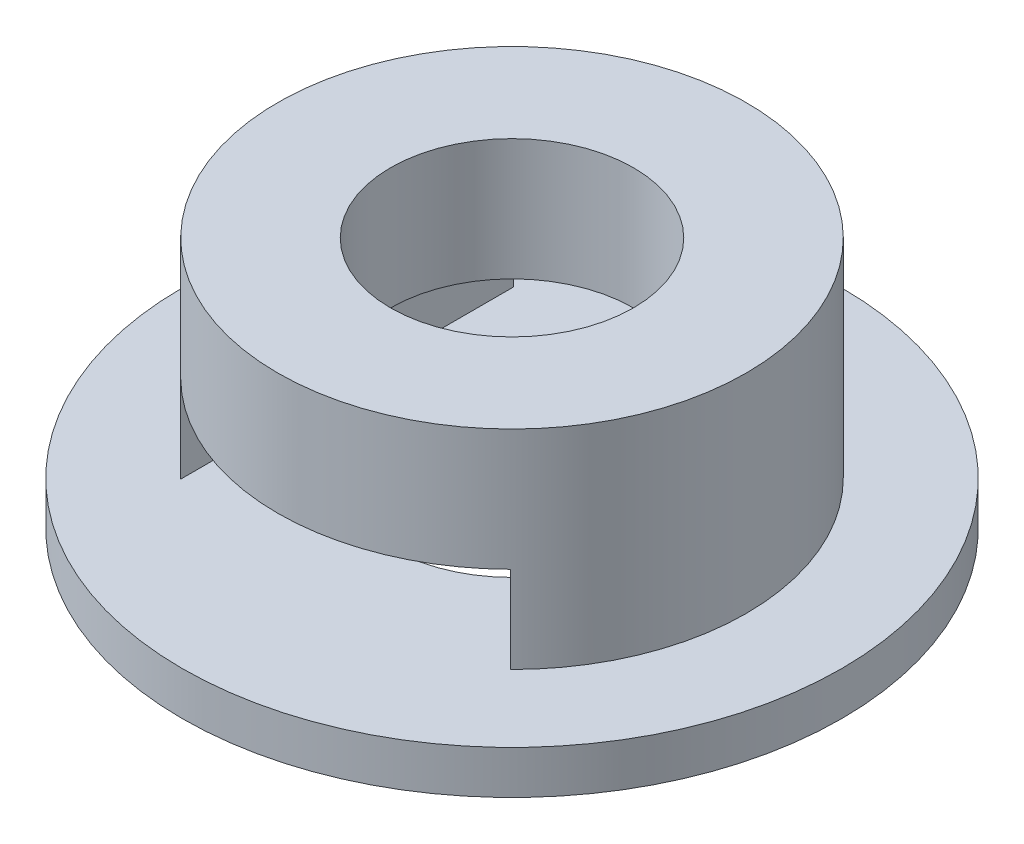
ISO-10303-21;
HEADER;
FILE_DESCRIPTION(('STEP AP214'),'2;1');
FILE_NAME('part.step','',(''),(''),'','','');
FILE_SCHEMA(('AUTOMOTIVE_DESIGN { 1 0 10303 214 1 1 1 1 }'));
ENDSEC;
DATA;
#1=APPLICATION_CONTEXT('core data for automotive mechanical design processes');
#2=APPLICATION_PROTOCOL_DEFINITION('international standard','automotive_design',2000,#1);
#3=PRODUCT_CONTEXT('',#1,'mechanical');
#4=PRODUCT('Part','Part','',(#3));
#5=PRODUCT_RELATED_PRODUCT_CATEGORY('part','',(#4));
#6=PRODUCT_DEFINITION_FORMATION('','',#4);
#7=PRODUCT_DEFINITION_CONTEXT('part definition',#1,'design');
#8=PRODUCT_DEFINITION('design','',#6,#7);
#9=PRODUCT_DEFINITION_SHAPE('','',#8);
#10=(LENGTH_UNIT() NAMED_UNIT(*) SI_UNIT(.MILLI.,.METRE.));
#11=(NAMED_UNIT(*) PLANE_ANGLE_UNIT() SI_UNIT($,.RADIAN.));
#12=(NAMED_UNIT(*) SI_UNIT($,.STERADIAN.) SOLID_ANGLE_UNIT());
#13=UNCERTAINTY_MEASURE_WITH_UNIT(LENGTH_MEASURE(1.E-05),#10,'distance_accuracy_value','');
#14=(GEOMETRIC_REPRESENTATION_CONTEXT(3) GLOBAL_UNCERTAINTY_ASSIGNED_CONTEXT((#13)) GLOBAL_UNIT_ASSIGNED_CONTEXT((#10,
#11,#12)) REPRESENTATION_CONTEXT('',''));
#15=CARTESIAN_POINT('',(0.,0.,0.));
#16=DIRECTION('',(0.,0.,1.));
#17=DIRECTION('',(1.,0.,0.));
#18=AXIS2_PLACEMENT_3D('',#15,#16,#17);
#19=CARTESIAN_POINT('',(0.,0.,0.));
#20=DIRECTION('',(0.,1.,0.));
#21=DIRECTION('',(0.,0.,1.));
#22=AXIS2_PLACEMENT_3D('',#19,#20,#21);
#23=CYLINDRICAL_SURFACE('',#22,7.);
#24=CARTESIAN_POINT('',(0.,7.5,0.));
#25=DIRECTION('',(0.,1.,0.));
#26=DIRECTION('',(0.,0.,1.));
#27=AXIS2_PLACEMENT_3D('',#24,#25,#26);
#28=CIRCLE('',#27,7.);
#29=CARTESIAN_POINT('',(0.,7.5,7.));
#30=VERTEX_POINT('',#29);
#31=EDGE_CURVE('E108',#30,#30,#28,.F.);
#32=CARTESIAN_POINT('',(0.,14.5,0.));
#33=DIRECTION('',(0.,1.,0.));
#34=DIRECTION('',(0.,0.,1.));
#35=AXIS2_PLACEMENT_3D('',#32,#33,#34);
#36=CIRCLE('',#35,7.);
#37=CARTESIAN_POINT('',(0.,14.5,7.));
#38=VERTEX_POINT('',#37);
#39=EDGE_CURVE('E94',#38,#38,#36,.T.);
#40=CARTESIAN_POINT('',(0.,7.5,7.));
#41=CARTESIAN_POINT('',(0.,7.57291666666667,7.));
#42=CARTESIAN_POINT('',(0.,7.64583333333333,7.));
#43=CARTESIAN_POINT('',(0.,7.79166666666667,7.));
#44=CARTESIAN_POINT('',(0.,7.86458333333333,7.));
#45=CARTESIAN_POINT('',(0.,8.01041666666667,7.));
#46=CARTESIAN_POINT('',(0.,8.08333333333333,7.));
#47=CARTESIAN_POINT('',(0.,8.22916666666667,7.));
#48=CARTESIAN_POINT('',(0.,8.30208333333333,7.));
#49=CARTESIAN_POINT('',(0.,8.44791666666667,7.));
#50=CARTESIAN_POINT('',(0.,8.52083333333333,7.));
#51=CARTESIAN_POINT('',(0.,8.66666666666667,7.));
#52=CARTESIAN_POINT('',(0.,8.73958333333333,7.));
#53=CARTESIAN_POINT('',(0.,8.88541666666667,7.));
#54=CARTESIAN_POINT('',(0.,8.95833333333333,7.));
#55=CARTESIAN_POINT('',(0.,9.10416666666667,7.));
#56=CARTESIAN_POINT('',(0.,9.17708333333333,7.));
#57=CARTESIAN_POINT('',(0.,9.32291666666667,7.));
#58=CARTESIAN_POINT('',(0.,9.39583333333333,7.));
#59=CARTESIAN_POINT('',(0.,9.54166666666667,7.));
#60=CARTESIAN_POINT('',(0.,9.61458333333333,7.));
#61=CARTESIAN_POINT('',(0.,9.76041666666667,7.));
#62=CARTESIAN_POINT('',(0.,9.83333333333333,7.));
#63=CARTESIAN_POINT('',(0.,9.97916666666667,7.));
#64=CARTESIAN_POINT('',(0.,10.0520833333333,7.));
#65=CARTESIAN_POINT('',(0.,10.1979166666667,7.));
#66=CARTESIAN_POINT('',(0.,10.2708333333333,7.));
#67=CARTESIAN_POINT('',(0.,10.4166666666667,7.));
#68=CARTESIAN_POINT('',(0.,10.4895833333333,7.));
#69=CARTESIAN_POINT('',(0.,10.6354166666667,7.));
#70=CARTESIAN_POINT('',(0.,10.7083333333333,7.));
#71=CARTESIAN_POINT('',(0.,10.8541666666667,7.));
#72=CARTESIAN_POINT('',(0.,10.9270833333333,7.));
#73=CARTESIAN_POINT('',(0.,11.0729166666667,7.));
#74=CARTESIAN_POINT('',(0.,11.1458333333333,7.));
#75=CARTESIAN_POINT('',(0.,11.2916666666667,7.));
#76=CARTESIAN_POINT('',(0.,11.3645833333333,7.));
#77=CARTESIAN_POINT('',(0.,11.5104166666667,7.));
#78=CARTESIAN_POINT('',(0.,11.5833333333333,7.));
#79=CARTESIAN_POINT('',(0.,11.7291666666667,7.));
#80=CARTESIAN_POINT('',(0.,11.8020833333333,7.));
#81=CARTESIAN_POINT('',(0.,11.9479166666667,7.));
#82=CARTESIAN_POINT('',(0.,12.0208333333333,7.));
#83=CARTESIAN_POINT('',(0.,12.1666666666667,7.));
#84=CARTESIAN_POINT('',(0.,12.2395833333333,7.));
#85=CARTESIAN_POINT('',(0.,12.3854166666667,7.));
#86=CARTESIAN_POINT('',(0.,12.4583333333333,7.));
#87=CARTESIAN_POINT('',(0.,12.6041666666667,7.));
#88=CARTESIAN_POINT('',(0.,12.6770833333333,7.));
#89=CARTESIAN_POINT('',(0.,12.8229166666667,7.));
#90=CARTESIAN_POINT('',(0.,12.8958333333333,7.));
#91=CARTESIAN_POINT('',(0.,13.0416666666667,7.));
#92=CARTESIAN_POINT('',(0.,13.1145833333333,7.));
#93=CARTESIAN_POINT('',(0.,13.2604166666667,7.));
#94=CARTESIAN_POINT('',(0.,13.3333333333333,7.));
#95=CARTESIAN_POINT('',(0.,13.4791666666667,7.));
#96=CARTESIAN_POINT('',(0.,13.5520833333333,7.));
#97=CARTESIAN_POINT('',(0.,13.6979166666667,7.));
#98=CARTESIAN_POINT('',(0.,13.7708333333333,7.));
#99=CARTESIAN_POINT('',(0.,13.9166666666667,7.));
#100=CARTESIAN_POINT('',(0.,13.9895833333333,7.));
#101=CARTESIAN_POINT('',(0.,14.1354166666667,7.));
#102=CARTESIAN_POINT('',(0.,14.2083333333333,7.));
#103=CARTESIAN_POINT('',(0.,14.3541666666667,7.));
#104=CARTESIAN_POINT('',(0.,14.4270833333333,7.));
#105=CARTESIAN_POINT('',(0.,14.5,7.));
#106=B_SPLINE_CURVE_WITH_KNOTS('',3,(#40,#41,#42,#43,#44,#45,#46,#47,#48,#49,#50,#51,#52,#53,
#54,#55,#56,#57,#58,#59,#60,#61,#62,#63,#64,#65,#66,#67,#68,#69,#70,#71,#72,#73,#74,#75,#76,#77,
#78,#79,#80,#81,#82,#83,#84,#85,#86,#87,#88,#89,#90,#91,#92,#93,#94,#95,#96,#97,#98,#99,#100,
#101,#102,#103,#104,#105),.UNSPECIFIED.,.F.,.F.,(4,2,2,2,2,2,2,2,2,2,2,2,2,2,2,2,2,2,2,2,2,2,2,
2,2,2,2,2,2,2,2,2,4),(0.,0.21875,0.4375,0.65625,0.875,1.09375,1.3125,1.53125,1.75,1.96875,
2.1875,2.40625,2.625,2.84375,3.0625,3.28125,3.5,3.71875,3.9375,4.15625,4.375,4.59375,4.8125,
5.03125,5.25,5.46875,5.6875,5.90625,6.125,6.34375,6.5625,6.78125,7.),.UNSPECIFIED.);
#107=EDGE_CURVE('BSEAM33',#30,#38,#106,.T.);
#108=ORIENTED_EDGE('',*,*,#31,.T.);
#109=ORIENTED_EDGE('',*,*,#39,.T.);
#110=ORIENTED_EDGE('',*,*,#107,.T.);
#111=ORIENTED_EDGE('',*,*,#107,.F.);
#112=EDGE_LOOP('',(#108,#110,#109,#111));
#113=FACE_BOUND('',#112,.T.);
#114=ADVANCED_FACE('F33',(#113),#23,.F.);
#115=CARTESIAN_POINT('',(0.,2.5,0.));
#116=DIRECTION('',(0.,1.,0.));
#117=DIRECTION('',(0.,0.,1.));
#118=AXIS2_PLACEMENT_3D('',#115,#116,#117);
#119=PLANE('',#118);
#120=CARTESIAN_POINT('',(0.,2.5,0.));
#121=DIRECTION('',(0.,1.,0.));
#122=DIRECTION('',(0.,0.,1.));
#123=AXIS2_PLACEMENT_3D('',#120,#121,#122);
#124=CIRCLE('',#123,13.5);
#125=CARTESIAN_POINT('',(-9.5,2.5,-9.59166304662544));
#126=VERTEX_POINT('',#125);
#127=CARTESIAN_POINT('',(-9.5,2.5,9.59166304662544));
#128=VERTEX_POINT('',#127);
#129=EDGE_CURVE('E82',#126,#128,#124,.T.);
#130=ORIENTED_EDGE('',*,*,#129,.F.);
#131=DIRECTION('',(0.,0.,1.));
#132=VECTOR('',#131,1.);
#133=CARTESIAN_POINT('',(-9.5,2.5,-17.5));
#134=LINE('',#133,#132);
#135=EDGE_CURVE('E47',#126,#128,#134,.T.);
#136=ORIENTED_EDGE('',*,*,#135,.T.);
#137=EDGE_LOOP('',(#130,#136));
#138=FACE_BOUND('',#137,.T.);
#139=CARTESIAN_POINT('',(9.5,2.5,9.59166304662544));
#140=VERTEX_POINT('',#139);
#141=CARTESIAN_POINT('',(9.5,2.5,-9.59166304662544));
#142=VERTEX_POINT('',#141);
#143=EDGE_CURVE('E88',#140,#142,#124,.T.);
#144=ORIENTED_EDGE('',*,*,#143,.F.);
#145=DIRECTION('',(0.,0.,1.));
#146=VECTOR('',#145,1.);
#147=CARTESIAN_POINT('',(9.5,2.5,-17.5));
#148=LINE('',#147,#146);
#149=EDGE_CURVE('E54',#142,#140,#148,.T.);
#150=ORIENTED_EDGE('',*,*,#149,.F.);
#151=EDGE_LOOP('',(#144,#150));
#152=FACE_BOUND('',#151,.T.);
#153=CARTESIAN_POINT('',(0.,2.5,0.));
#154=DIRECTION('',(0.,1.,0.));
#155=DIRECTION('',(0.,0.,1.));
#156=AXIS2_PLACEMENT_3D('',#153,#154,#155);
#157=CIRCLE('',#156,19.);
#158=CARTESIAN_POINT('',(0.,2.5,19.));
#159=VERTEX_POINT('',#158);
#160=EDGE_CURVE('E99',#159,#159,#157,.T.);
#161=ORIENTED_EDGE('',*,*,#160,.T.);
#162=EDGE_LOOP('',(#161));
#163=FACE_BOUND('',#162,.T.);
#164=CARTESIAN_POINT('',(0.,2.5,0.));
#165=DIRECTION('',(0.,-1.,0.));
#166=DIRECTION('',(0.,0.,-1.));
#167=AXIS2_PLACEMENT_3D('',#164,#165,#166);
#168=CIRCLE('',#167,7.);
#169=CARTESIAN_POINT('',(0.,2.5,7.));
#170=VERTEX_POINT('',#169);
#171=EDGE_CURVE('E105',#170,#170,#168,.F.);
#172=ORIENTED_EDGE('',*,*,#171,.F.);
#173=EDGE_LOOP('',(#172));
#174=FACE_BOUND('',#173,.T.);
#175=ADVANCED_FACE('F87',(#138,#152,#163,#174),#119,.T.);
#176=CARTESIAN_POINT('',(0.,2.5,0.));
#177=DIRECTION('',(0.,-1.,0.));
#178=DIRECTION('',(0.,0.,-1.));
#179=AXIS2_PLACEMENT_3D('',#176,#177,#178);
#180=CYLINDRICAL_SURFACE('',#179,19.);
#181=ORIENTED_EDGE('',*,*,#160,.F.);
#182=EDGE_LOOP('',(#181));
#183=FACE_BOUND('',#182,.T.);
#184=CARTESIAN_POINT('',(0.,0.,0.));
#185=DIRECTION('',(0.,1.,0.));
#186=DIRECTION('',(0.,0.,1.));
#187=AXIS2_PLACEMENT_3D('',#184,#185,#186);
#188=CIRCLE('',#187,19.);
#189=CARTESIAN_POINT('',(0.,0.,19.));
#190=VERTEX_POINT('',#189);
#191=EDGE_CURVE('E102',#190,#190,#188,.T.);
#192=ORIENTED_EDGE('',*,*,#191,.T.);
#193=EDGE_LOOP('',(#192));
#194=FACE_BOUND('',#193,.T.);
#195=ADVANCED_FACE('F35',(#183,#194),#180,.T.);
#196=CARTESIAN_POINT('',(0.,0.,0.));
#197=DIRECTION('',(0.,1.,0.));
#198=DIRECTION('',(0.,0.,1.));
#199=AXIS2_PLACEMENT_3D('',#196,#197,#198);
#200=PLANE('',#199);
#201=CARTESIAN_POINT('',(0.,0.,0.));
#202=DIRECTION('',(0.,1.,0.));
#203=DIRECTION('',(0.,0.,1.));
#204=AXIS2_PLACEMENT_3D('',#201,#202,#203);
#205=CIRCLE('',#204,7.);
#206=CARTESIAN_POINT('',(0.,0.,7.));
#207=VERTEX_POINT('',#206);
#208=EDGE_CURVE('E89',#207,#207,#205,.T.);
#209=ORIENTED_EDGE('',*,*,#208,.T.);
#210=EDGE_LOOP('',(#209));
#211=FACE_BOUND('',#210,.T.);
#212=ORIENTED_EDGE('',*,*,#191,.F.);
#213=EDGE_LOOP('',(#212));
#214=FACE_BOUND('',#213,.T.);
#215=ADVANCED_FACE('F132',(#211,#214),#200,.F.);
#216=CARTESIAN_POINT('',(0.,14.5,0.));
#217=DIRECTION('',(0.,-1.,0.));
#218=DIRECTION('',(0.,0.,-1.));
#219=AXIS2_PLACEMENT_3D('',#216,#217,#218);
#220=CYLINDRICAL_SURFACE('',#219,13.5);
#221=CARTESIAN_POINT('',(0.,14.5,0.));
#222=DIRECTION('',(0.,1.,0.));
#223=DIRECTION('',(0.,0.,1.));
#224=AXIS2_PLACEMENT_3D('',#221,#222,#223);
#225=CIRCLE('',#224,13.5);
#226=CARTESIAN_POINT('',(0.,14.5,13.5));
#227=VERTEX_POINT('',#226);
#228=EDGE_CURVE('E92',#227,#227,#225,.T.);
#229=ORIENTED_EDGE('',*,*,#228,.F.);
#230=EDGE_LOOP('',(#229));
#231=FACE_BOUND('',#230,.T.);
#232=ORIENTED_EDGE('',*,*,#129,.T.);
#233=DIRECTION('',(0.,-1.,0.));
#234=VECTOR('',#233,1.);
#235=CARTESIAN_POINT('',(-9.5,14.5,9.59166304662544));
#236=LINE('',#235,#234);
#237=CARTESIAN_POINT('',(-9.5,7.5,9.59166304662544));
#238=VERTEX_POINT('',#237);
#239=EDGE_CURVE('E11',#128,#238,#236,.F.);
#240=ORIENTED_EDGE('',*,*,#239,.T.);
#241=CARTESIAN_POINT('',(0.,7.5,0.));
#242=DIRECTION('',(0.,1.,0.));
#243=DIRECTION('',(0.,0.,1.));
#244=AXIS2_PLACEMENT_3D('',#241,#242,#243);
#245=CIRCLE('',#244,13.5);
#246=CARTESIAN_POINT('',(9.5,7.5,9.59166304662544));
#247=VERTEX_POINT('',#246);
#248=EDGE_CURVE('E112',#238,#247,#245,.T.);
#249=ORIENTED_EDGE('',*,*,#248,.T.);
#250=DIRECTION('',(0.,-1.,0.));
#251=VECTOR('',#250,1.);
#252=CARTESIAN_POINT('',(9.5,14.5,9.59166304662544));
#253=LINE('',#252,#251);
#254=EDGE_CURVE('E41',#247,#140,#253,.T.);
#255=ORIENTED_EDGE('',*,*,#254,.T.);
#256=ORIENTED_EDGE('',*,*,#143,.T.);
#257=DIRECTION('',(0.,-1.,0.));
#258=VECTOR('',#257,1.);
#259=CARTESIAN_POINT('',(9.5,14.5,-9.59166304662544));
#260=LINE('',#259,#258);
#261=CARTESIAN_POINT('',(9.5,7.5,-9.59166304662544));
#262=VERTEX_POINT('',#261);
#263=EDGE_CURVE('E85',#142,#262,#260,.F.);
#264=ORIENTED_EDGE('',*,*,#263,.T.);
#265=CARTESIAN_POINT('',(-9.5,7.5,-9.59166304662544));
#266=VERTEX_POINT('',#265);
#267=EDGE_CURVE('E84',#262,#266,#245,.T.);
#268=ORIENTED_EDGE('',*,*,#267,.T.);
#269=DIRECTION('',(0.,-1.,0.));
#270=VECTOR('',#269,1.);
#271=CARTESIAN_POINT('',(-9.5,14.5,-9.59166304662544));
#272=LINE('',#271,#270);
#273=EDGE_CURVE('E75',#266,#126,#272,.T.);
#274=ORIENTED_EDGE('',*,*,#273,.T.);
#275=EDGE_LOOP('',(#232,#240,#249,#255,#256,#264,#268,#274));
#276=FACE_BOUND('',#275,.T.);
#277=ADVANCED_FACE('F81',(#231,#276),#220,.T.);
#278=CARTESIAN_POINT('',(0.,14.5,0.));
#279=DIRECTION('',(0.,1.,0.));
#280=DIRECTION('',(0.,0.,1.));
#281=AXIS2_PLACEMENT_3D('',#278,#279,#280);
#282=PLANE('',#281);
#283=ORIENTED_EDGE('',*,*,#39,.F.);
#284=EDGE_LOOP('',(#283));
#285=FACE_BOUND('',#284,.T.);
#286=ORIENTED_EDGE('',*,*,#228,.T.);
#287=EDGE_LOOP('',(#286));
#288=FACE_BOUND('',#287,.T.);
#289=ADVANCED_FACE('F128',(#285,#288),#282,.T.);
#290=CARTESIAN_POINT('',(0.,2.5,7.));
#291=CARTESIAN_POINT('',(0.,2.47395833333333,7.));
#292=CARTESIAN_POINT('',(0.,2.44791666666667,7.));
#293=CARTESIAN_POINT('',(0.,2.39583333333333,7.));
#294=CARTESIAN_POINT('',(0.,2.36979166666667,7.));
#295=CARTESIAN_POINT('',(0.,2.31770833333333,7.));
#296=CARTESIAN_POINT('',(0.,2.29166666666667,7.));
#297=CARTESIAN_POINT('',(0.,2.23958333333333,7.));
#298=CARTESIAN_POINT('',(0.,2.21354166666667,7.));
#299=CARTESIAN_POINT('',(0.,2.16145833333333,7.));
#300=CARTESIAN_POINT('',(0.,2.13541666666667,7.));
#301=CARTESIAN_POINT('',(0.,2.08333333333333,7.));
#302=CARTESIAN_POINT('',(0.,2.05729166666667,7.));
#303=CARTESIAN_POINT('',(0.,2.00520833333333,7.));
#304=CARTESIAN_POINT('',(0.,1.97916666666667,7.));
#305=CARTESIAN_POINT('',(0.,1.92708333333333,7.));
#306=CARTESIAN_POINT('',(0.,1.90104166666667,7.));
#307=CARTESIAN_POINT('',(0.,1.84895833333333,7.));
#308=CARTESIAN_POINT('',(0.,1.82291666666667,7.));
#309=CARTESIAN_POINT('',(0.,1.77083333333333,7.));
#310=CARTESIAN_POINT('',(0.,1.74479166666667,7.));
#311=CARTESIAN_POINT('',(0.,1.69270833333333,7.));
#312=CARTESIAN_POINT('',(0.,1.66666666666667,7.));
#313=CARTESIAN_POINT('',(0.,1.61458333333333,7.));
#314=CARTESIAN_POINT('',(0.,1.58854166666667,7.));
#315=CARTESIAN_POINT('',(0.,1.53645833333333,7.));
#316=CARTESIAN_POINT('',(0.,1.51041666666667,7.));
#317=CARTESIAN_POINT('',(0.,1.45833333333333,7.));
#318=CARTESIAN_POINT('',(0.,1.43229166666667,7.));
#319=CARTESIAN_POINT('',(0.,1.38020833333333,7.));
#320=CARTESIAN_POINT('',(0.,1.35416666666667,7.));
#321=CARTESIAN_POINT('',(0.,1.30208333333333,7.));
#322=CARTESIAN_POINT('',(0.,1.27604166666667,7.));
#323=CARTESIAN_POINT('',(0.,1.22395833333333,7.));
#324=CARTESIAN_POINT('',(0.,1.19791666666667,7.));
#325=CARTESIAN_POINT('',(0.,1.14583333333333,7.));
#326=CARTESIAN_POINT('',(0.,1.11979166666667,7.));
#327=CARTESIAN_POINT('',(0.,1.06770833333333,7.));
#328=CARTESIAN_POINT('',(0.,1.04166666666667,7.));
#329=CARTESIAN_POINT('',(0.,0.989583333333333,7.));
#330=CARTESIAN_POINT('',(0.,0.963541666666667,7.));
#331=CARTESIAN_POINT('',(0.,0.911458333333333,7.));
#332=CARTESIAN_POINT('',(0.,0.885416666666667,7.));
#333=CARTESIAN_POINT('',(0.,0.833333333333333,7.));
#334=CARTESIAN_POINT('',(0.,0.807291666666667,7.));
#335=CARTESIAN_POINT('',(0.,0.755208333333333,7.));
#336=CARTESIAN_POINT('',(0.,0.729166666666667,7.));
#337=CARTESIAN_POINT('',(0.,0.677083333333333,7.));
#338=CARTESIAN_POINT('',(0.,0.651041666666667,7.));
#339=CARTESIAN_POINT('',(0.,0.598958333333333,7.));
#340=CARTESIAN_POINT('',(0.,0.572916666666667,7.));
#341=CARTESIAN_POINT('',(0.,0.520833333333333,7.));
#342=CARTESIAN_POINT('',(0.,0.494791666666667,7.));
#343=CARTESIAN_POINT('',(0.,0.442708333333333,7.));
#344=CARTESIAN_POINT('',(0.,0.416666666666667,7.));
#345=CARTESIAN_POINT('',(0.,0.364583333333333,7.));
#346=CARTESIAN_POINT('',(0.,0.338541666666667,7.));
#347=CARTESIAN_POINT('',(0.,0.286458333333334,7.));
#348=CARTESIAN_POINT('',(0.,0.260416666666667,7.));
#349=CARTESIAN_POINT('',(0.,0.208333333333333,7.));
#350=CARTESIAN_POINT('',(0.,0.182291666666667,7.));
#351=CARTESIAN_POINT('',(0.,0.130208333333333,7.));
#352=CARTESIAN_POINT('',(0.,0.104166666666667,7.));
#353=CARTESIAN_POINT('',(0.,0.0520833333333334,7.));
#354=CARTESIAN_POINT('',(0.,0.0260416666666667,7.));
#355=CARTESIAN_POINT('',(0.,0.,7.));
#356=B_SPLINE_CURVE_WITH_KNOTS('',3,(#290,#291,#292,#293,#294,#295,#296,#297,#298,#299,#300,
#301,#302,#303,#304,#305,#306,#307,#308,#309,#310,#311,#312,#313,#314,#315,#316,#317,#318,#319,
#320,#321,#322,#323,#324,#325,#326,#327,#328,#329,#330,#331,#332,#333,#334,#335,#336,#337,#338,
#339,#340,#341,#342,#343,#344,#345,#346,#347,#348,#349,#350,#351,#352,#353,#354,#355),
.UNSPECIFIED.,.F.,.F.,(4,2,2,2,2,2,2,2,2,2,2,2,2,2,2,2,2,2,2,2,2,2,2,2,2,2,2,2,2,2,2,2,4),(0.,
0.0781250000000001,0.15625,0.234375,0.3125,0.390625,0.46875,0.546875,0.625,0.703125,0.78125,
0.859375,0.9375,1.015625,1.09375,1.171875,1.25,1.328125,1.40625,1.484375,1.5625,1.640625,
1.71875,1.796875,1.875,1.953125,2.03125,2.109375,2.1875,2.265625,2.34375,2.421875,2.5),.UNSPECIFIED.);
#357=EDGE_CURVE('BSEAM125',#170,#207,#356,.T.);
#358=ORIENTED_EDGE('',*,*,#171,.T.);
#359=ORIENTED_EDGE('',*,*,#208,.F.);
#360=ORIENTED_EDGE('',*,*,#357,.T.);
#361=ORIENTED_EDGE('',*,*,#357,.F.);
#362=EDGE_LOOP('',(#358,#360,#359,#361));
#363=FACE_BOUND('',#362,.T.);
#364=ADVANCED_FACE('F125',(#363),#23,.F.);
#365=CARTESIAN_POINT('',(-9.5,2.5,-17.5));
#366=DIRECTION('',(-1.,0.,0.));
#367=DIRECTION('',(0.,0.,1.));
#368=AXIS2_PLACEMENT_3D('',#365,#366,#367);
#369=PLANE('',#368);
#370=DIRECTION('',(0.,0.,1.));
#371=VECTOR('',#370,1.);
#372=CARTESIAN_POINT('',(-9.5,7.5,-17.5));
#373=LINE('',#372,#371);
#374=EDGE_CURVE('E109',#266,#238,#373,.T.);
#375=ORIENTED_EDGE('',*,*,#374,.T.);
#376=ORIENTED_EDGE('',*,*,#239,.F.);
#377=ORIENTED_EDGE('',*,*,#135,.F.);
#378=ORIENTED_EDGE('',*,*,#273,.F.);
#379=EDGE_LOOP('',(#375,#376,#377,#378));
#380=FACE_BOUND('',#379,.T.);
#381=ADVANCED_FACE('F74',(#380),#369,.F.);
#382=CARTESIAN_POINT('',(9.5,2.5,-17.5));
#383=DIRECTION('',(1.,0.,0.));
#384=DIRECTION('',(0.,0.,-1.));
#385=AXIS2_PLACEMENT_3D('',#382,#383,#384);
#386=PLANE('',#385);
#387=DIRECTION('',(0.,0.,1.));
#388=VECTOR('',#387,1.);
#389=CARTESIAN_POINT('',(9.5,7.5,-17.5));
#390=LINE('',#389,#388);
#391=EDGE_CURVE('E225',#262,#247,#390,.T.);
#392=ORIENTED_EDGE('',*,*,#391,.F.);
#393=ORIENTED_EDGE('',*,*,#263,.F.);
#394=ORIENTED_EDGE('',*,*,#149,.T.);
#395=ORIENTED_EDGE('',*,*,#254,.F.);
#396=EDGE_LOOP('',(#392,#393,#394,#395));
#397=FACE_BOUND('',#396,.T.);
#398=ADVANCED_FACE('F175',(#397),#386,.F.);
#399=CARTESIAN_POINT('',(-9.5,7.5,-17.5));
#400=DIRECTION('',(0.,1.,0.));
#401=DIRECTION('',(0.,0.,1.));
#402=AXIS2_PLACEMENT_3D('',#399,#400,#401);
#403=PLANE('',#402);
#404=ORIENTED_EDGE('',*,*,#31,.F.);
#405=EDGE_LOOP('',(#404));
#406=FACE_BOUND('',#405,.T.);
#407=ORIENTED_EDGE('',*,*,#391,.T.);
#408=ORIENTED_EDGE('',*,*,#248,.F.);
#409=ORIENTED_EDGE('',*,*,#374,.F.);
#410=ORIENTED_EDGE('',*,*,#267,.F.);
#411=EDGE_LOOP('',(#407,#408,#409,#410));
#412=FACE_BOUND('',#411,.T.);
#413=ADVANCED_FACE('F181',(#406,#412),#403,.F.);
#414=CLOSED_SHELL('',(#114,#175,#195,#215,#277,#289,#364,#381,#398,#413));
#415=MANIFOLD_SOLID_BREP('B2',#414);
#416=ADVANCED_BREP_SHAPE_REPRESENTATION('',(#18,#415),#14);
#417=SHAPE_DEFINITION_REPRESENTATION(#9,#416);
ENDSEC;
END-ISO-10303-21;
